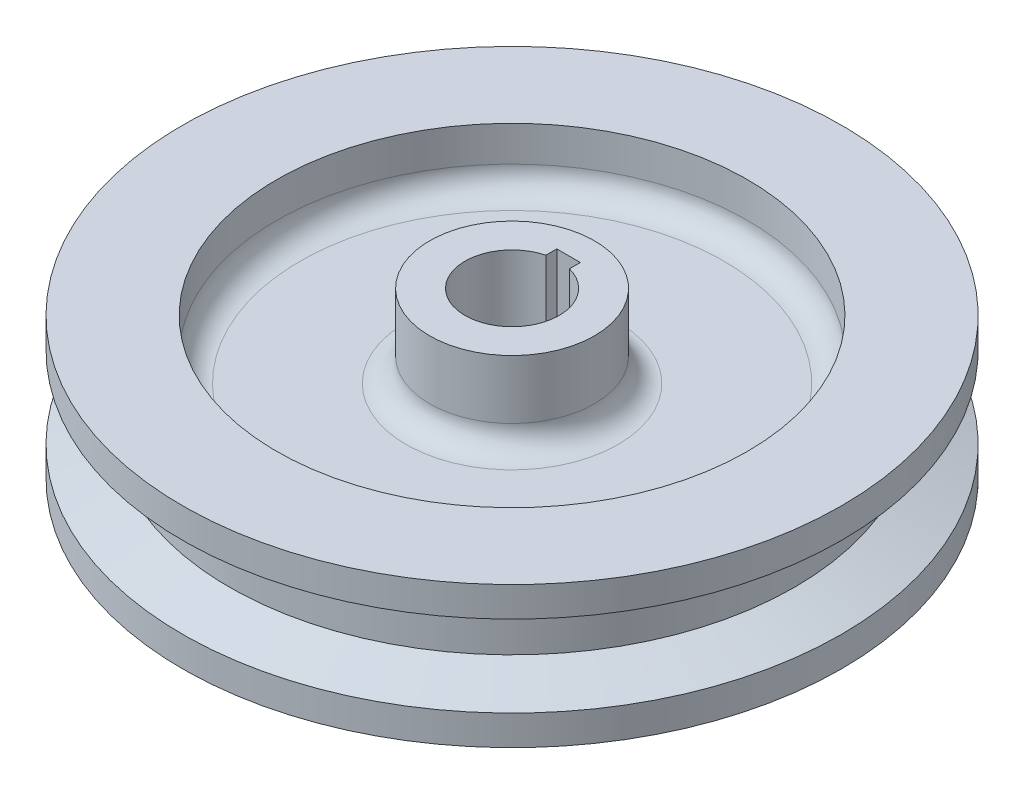
ISO-10303-21;
HEADER;
FILE_DESCRIPTION(('STEP AP214'),'2;1');
FILE_NAME('part.step','',(''),(''),'','','');
FILE_SCHEMA(('AUTOMOTIVE_DESIGN { 1 0 10303 214 1 1 1 1 }'));
ENDSEC;
DATA;
#1=APPLICATION_CONTEXT('core data for automotive mechanical design processes');
#2=APPLICATION_PROTOCOL_DEFINITION('international standard','automotive_design',2000,#1);
#3=PRODUCT_CONTEXT('',#1,'mechanical');
#4=PRODUCT('Part','Part','',(#3));
#5=PRODUCT_RELATED_PRODUCT_CATEGORY('part','',(#4));
#6=PRODUCT_DEFINITION_FORMATION('','',#4);
#7=PRODUCT_DEFINITION_CONTEXT('part definition',#1,'design');
#8=PRODUCT_DEFINITION('design','',#6,#7);
#9=PRODUCT_DEFINITION_SHAPE('','',#8);
#10=(LENGTH_UNIT() NAMED_UNIT(*) SI_UNIT(.MILLI.,.METRE.));
#11=(NAMED_UNIT(*) PLANE_ANGLE_UNIT() SI_UNIT($,.RADIAN.));
#12=(NAMED_UNIT(*) SI_UNIT($,.STERADIAN.) SOLID_ANGLE_UNIT());
#13=UNCERTAINTY_MEASURE_WITH_UNIT(LENGTH_MEASURE(1.E-05),#10,'distance_accuracy_value','');
#14=(GEOMETRIC_REPRESENTATION_CONTEXT(3) GLOBAL_UNCERTAINTY_ASSIGNED_CONTEXT((#13)) GLOBAL_UNIT_ASSIGNED_CONTEXT((#10,
#11,#12)) REPRESENTATION_CONTEXT('',''));
#15=CARTESIAN_POINT('',(0.,0.,0.));
#16=DIRECTION('',(0.,0.,1.));
#17=DIRECTION('',(1.,0.,0.));
#18=AXIS2_PLACEMENT_3D('',#15,#16,#17);
#19=CARTESIAN_POINT('',(3.49148336110938E-12,-1000.,0.));
#20=DIRECTION('',(0.,-1.,0.));
#21=DIRECTION('',(1.,0.,0.));
#22=AXIS2_PLACEMENT_3D('',#19,#20,#21);
#23=CYLINDRICAL_SURFACE('',#22,22.2250000000001);
#24=CARTESIAN_POINT('',(0.,25.4000000000001,0.));
#25=DIRECTION('',(0.,-1.,0.));
#26=DIRECTION('',(1.,0.,0.));
#27=AXIS2_PLACEMENT_3D('',#24,#25,#26);
#28=CIRCLE('',#27,22.2250000000001);
#29=CARTESIAN_POINT('',(22.225,25.4000000000002,0.));
#30=VERTEX_POINT('',#29);
#31=EDGE_CURVE('E102',#30,#30,#28,.T.);
#32=ORIENTED_EDGE('',*,*,#31,.T.);
#33=EDGE_LOOP('',(#32));
#34=FACE_BOUND('',#33,.T.);
#35=CARTESIAN_POINT('',(0.,9.52500000000001,0.));
#36=DIRECTION('',(0.,-1.,0.));
#37=DIRECTION('',(1.,0.,0.));
#38=AXIS2_PLACEMENT_3D('',#35,#36,#37);
#39=CIRCLE('',#38,22.225);
#40=CARTESIAN_POINT('',(22.225,9.52500000000008,0.));
#41=VERTEX_POINT('',#40);
#42=EDGE_CURVE('E42',#41,#41,#39,.T.);
#43=ORIENTED_EDGE('',*,*,#42,.F.);
#44=EDGE_LOOP('',(#43));
#45=FACE_BOUND('',#44,.T.);
#46=ADVANCED_FACE('F35',(#34,#45),#23,.T.);
#47=CARTESIAN_POINT('',(0.,9.525,0.));
#48=DIRECTION('',(0.,-1.,0.));
#49=DIRECTION('',(1.,0.,0.));
#50=AXIS2_PLACEMENT_3D('',#47,#48,#49);
#51=TOROIDAL_SURFACE('',#50,28.575,6.35);
#52=ORIENTED_EDGE('',*,*,#42,.T.);
#53=EDGE_LOOP('',(#52));
#54=FACE_BOUND('',#53,.T.);
#55=CARTESIAN_POINT('',(0.,3.17499999999993,0.));
#56=DIRECTION('',(0.,-1.,0.));
#57=DIRECTION('',(1.,0.,0.));
#58=AXIS2_PLACEMENT_3D('',#55,#56,#57);
#59=CIRCLE('',#58,28.5750000000001);
#60=CARTESIAN_POINT('',(28.575,3.17500000000003,0.));
#61=VERTEX_POINT('',#60);
#62=EDGE_CURVE('E155',#61,#61,#59,.T.);
#63=ORIENTED_EDGE('',*,*,#62,.F.);
#64=EDGE_LOOP('',(#63));
#65=FACE_BOUND('',#64,.T.);
#66=ADVANCED_FACE('F160',(#54,#65),#51,.F.);
#67=CARTESIAN_POINT('',(28.575,3.17499999999995,0.));
#68=DIRECTION('',(0.,1.,0.));
#69=DIRECTION('',(-1.,0.,0.));
#70=AXIS2_PLACEMENT_3D('',#67,#68,#69);
#71=PLANE('',#70);
#72=ORIENTED_EDGE('',*,*,#62,.T.);
#73=EDGE_LOOP('',(#72));
#74=FACE_BOUND('',#73,.T.);
#75=CARTESIAN_POINT('',(0.,3.17499999999971,0.));
#76=DIRECTION('',(0.,-1.,0.));
#77=DIRECTION('',(1.,0.,0.));
#78=AXIS2_PLACEMENT_3D('',#75,#76,#77);
#79=CIRCLE('',#78,57.15);
#80=CARTESIAN_POINT('',(57.15,3.17499999999991,0.));
#81=VERTEX_POINT('',#80);
#82=EDGE_CURVE('E152',#81,#81,#79,.T.);
#83=ORIENTED_EDGE('',*,*,#82,.F.);
#84=EDGE_LOOP('',(#83));
#85=FACE_BOUND('',#84,.T.);
#86=ADVANCED_FACE('F168',(#74,#85),#71,.T.);
#87=CARTESIAN_POINT('',(0.,9.52499999999978,0.));
#88=DIRECTION('',(0.,-1.,0.));
#89=DIRECTION('',(1.,0.,0.));
#90=AXIS2_PLACEMENT_3D('',#87,#88,#89);
#91=TOROIDAL_SURFACE('',#90,57.15,6.35);
#92=ORIENTED_EDGE('',*,*,#82,.T.);
#93=EDGE_LOOP('',(#92));
#94=FACE_BOUND('',#93,.T.);
#95=CARTESIAN_POINT('',(0.,9.52499999999978,0.));
#96=DIRECTION('',(0.,-1.,0.));
#97=DIRECTION('',(1.,0.,0.));
#98=AXIS2_PLACEMENT_3D('',#95,#96,#97);
#99=CIRCLE('',#98,63.5);
#100=CARTESIAN_POINT('',(63.5,9.52500000000001,0.));
#101=VERTEX_POINT('',#100);
#102=EDGE_CURVE('E149',#101,#101,#99,.T.);
#103=ORIENTED_EDGE('',*,*,#102,.F.);
#104=EDGE_LOOP('',(#103));
#105=FACE_BOUND('',#104,.T.);
#106=ADVANCED_FACE('F237',(#94,#105),#91,.F.);
#107=CARTESIAN_POINT('',(3.49148336110938E-12,-1000.,0.));
#108=DIRECTION('',(0.,-1.,0.));
#109=DIRECTION('',(1.,0.,0.));
#110=AXIS2_PLACEMENT_3D('',#107,#108,#109);
#111=CYLINDRICAL_SURFACE('',#110,63.5000000000001);
#112=ORIENTED_EDGE('',*,*,#102,.T.);
#113=EDGE_LOOP('',(#112));
#114=FACE_BOUND('',#113,.T.);
#115=CARTESIAN_POINT('',(0.,19.0499999999998,0.));
#116=DIRECTION('',(0.,-1.,0.));
#117=DIRECTION('',(1.,0.,0.));
#118=AXIS2_PLACEMENT_3D('',#115,#116,#117);
#119=CIRCLE('',#118,63.5000000000001);
#120=CARTESIAN_POINT('',(63.5,19.05,0.));
#121=VERTEX_POINT('',#120);
#122=EDGE_CURVE('E146',#121,#121,#119,.T.);
#123=ORIENTED_EDGE('',*,*,#122,.F.);
#124=EDGE_LOOP('',(#123));
#125=FACE_BOUND('',#124,.T.);
#126=ADVANCED_FACE('F233',(#114,#125),#111,.F.);
#127=CARTESIAN_POINT('',(63.5,19.05,0.));
#128=DIRECTION('',(0.,1.,0.));
#129=DIRECTION('',(-1.,0.,0.));
#130=AXIS2_PLACEMENT_3D('',#127,#128,#129);
#131=PLANE('',#130);
#132=ORIENTED_EDGE('',*,*,#122,.T.);
#133=EDGE_LOOP('',(#132));
#134=FACE_BOUND('',#133,.T.);
#135=CARTESIAN_POINT('',(0.,19.0499999999998,0.));
#136=DIRECTION('',(0.,-1.,0.));
#137=DIRECTION('',(1.,0.,0.));
#138=AXIS2_PLACEMENT_3D('',#135,#136,#137);
#139=CIRCLE('',#138,88.9);
#140=CARTESIAN_POINT('',(88.9,19.0500000000001,0.));
#141=VERTEX_POINT('',#140);
#142=EDGE_CURVE('E143',#141,#141,#139,.T.);
#143=ORIENTED_EDGE('',*,*,#142,.F.);
#144=EDGE_LOOP('',(#143));
#145=FACE_BOUND('',#144,.T.);
#146=ADVANCED_FACE('F229',(#134,#145),#131,.T.);
#147=CARTESIAN_POINT('',(3.49148336110938E-12,-1000.,0.));
#148=DIRECTION('',(0.,-1.,0.));
#149=DIRECTION('',(1.,0.,0.));
#150=AXIS2_PLACEMENT_3D('',#147,#148,#149);
#151=CYLINDRICAL_SURFACE('',#150,88.9);
#152=ORIENTED_EDGE('',*,*,#142,.T.);
#153=EDGE_LOOP('',(#152));
#154=FACE_BOUND('',#153,.T.);
#155=CARTESIAN_POINT('',(0.,10.9724219751806,0.));
#156=DIRECTION('',(0.,-1.,0.));
#157=DIRECTION('',(1.,0.,0.));
#158=AXIS2_PLACEMENT_3D('',#155,#156,#157);
#159=CIRCLE('',#158,88.9);
#160=CARTESIAN_POINT('',(88.9,10.9724219751809,0.));
#161=VERTEX_POINT('',#160);
#162=EDGE_CURVE('E140',#161,#161,#159,.T.);
#163=ORIENTED_EDGE('',*,*,#162,.F.);
#164=EDGE_LOOP('',(#163));
#165=FACE_BOUND('',#164,.T.);
#166=ADVANCED_FACE('F225',(#154,#165),#151,.T.);
#167=CARTESIAN_POINT('',(0.,6.34999999999986,0.));
#168=DIRECTION('',(0.,1.,0.));
#169=DIRECTION('',(-1.,0.,0.));
#170=AXIS2_PLACEMENT_3D('',#167,#168,#169);
#171=CONICAL_SURFACE('',#170,76.2,1.22173047639604);
#172=ORIENTED_EDGE('',*,*,#162,.T.);
#173=EDGE_LOOP('',(#172));
#174=FACE_BOUND('',#173,.T.);
#175=CARTESIAN_POINT('',(0.,6.34999999999986,0.));
#176=DIRECTION('',(0.,-1.,0.));
#177=DIRECTION('',(1.,0.,0.));
#178=AXIS2_PLACEMENT_3D('',#175,#176,#177);
#179=CIRCLE('',#178,76.2);
#180=CARTESIAN_POINT('',(76.2,6.35000000000012,0.));
#181=VERTEX_POINT('',#180);
#182=EDGE_CURVE('E137',#181,#181,#179,.T.);
#183=ORIENTED_EDGE('',*,*,#182,.F.);
#184=EDGE_LOOP('',(#183));
#185=FACE_BOUND('',#184,.T.);
#186=ADVANCED_FACE('F221',(#174,#185),#171,.T.);
#187=CARTESIAN_POINT('',(3.49148336110938E-12,-1000.,0.));
#188=DIRECTION('',(0.,-1.,0.));
#189=DIRECTION('',(1.,0.,0.));
#190=AXIS2_PLACEMENT_3D('',#187,#188,#189);
#191=CYLINDRICAL_SURFACE('',#190,76.2);
#192=ORIENTED_EDGE('',*,*,#182,.T.);
#193=EDGE_LOOP('',(#192));
#194=FACE_BOUND('',#193,.T.);
#195=CARTESIAN_POINT('',(0.,-6.35000000000019,0.));
#196=DIRECTION('',(0.,-1.,0.));
#197=DIRECTION('',(1.,0.,0.));
#198=AXIS2_PLACEMENT_3D('',#195,#196,#197);
#199=CIRCLE('',#198,76.2);
#200=CARTESIAN_POINT('',(76.2,-6.34999999999992,0.));
#201=VERTEX_POINT('',#200);
#202=EDGE_CURVE('E134',#201,#201,#199,.T.);
#203=ORIENTED_EDGE('',*,*,#202,.F.);
#204=EDGE_LOOP('',(#203));
#205=FACE_BOUND('',#204,.T.);
#206=ADVANCED_FACE('F217',(#194,#205),#191,.T.);
#207=CARTESIAN_POINT('',(0.,-10.972421975181,0.));
#208=DIRECTION('',(0.,-1.,0.));
#209=DIRECTION('',(1.,0.,0.));
#210=AXIS2_PLACEMENT_3D('',#207,#208,#209);
#211=CONICAL_SURFACE('',#210,88.8999999999999,1.22173047639603);
#212=ORIENTED_EDGE('',*,*,#202,.T.);
#213=EDGE_LOOP('',(#212));
#214=FACE_BOUND('',#213,.T.);
#215=CARTESIAN_POINT('',(0.,-10.972421975181,0.));
#216=DIRECTION('',(0.,-1.,0.));
#217=DIRECTION('',(1.,0.,0.));
#218=AXIS2_PLACEMENT_3D('',#215,#216,#217);
#219=CIRCLE('',#218,88.8999999999999);
#220=CARTESIAN_POINT('',(88.9,-10.9724219751807,0.));
#221=VERTEX_POINT('',#220);
#222=EDGE_CURVE('E131',#221,#221,#219,.T.);
#223=ORIENTED_EDGE('',*,*,#222,.F.);
#224=EDGE_LOOP('',(#223));
#225=FACE_BOUND('',#224,.T.);
#226=ADVANCED_FACE('F213',(#214,#225),#211,.T.);
#227=CARTESIAN_POINT('',(3.49148336110938E-12,-1000.,0.));
#228=DIRECTION('',(0.,-1.,0.));
#229=DIRECTION('',(1.,0.,0.));
#230=AXIS2_PLACEMENT_3D('',#227,#228,#229);
#231=CYLINDRICAL_SURFACE('',#230,88.8999999999999);
#232=ORIENTED_EDGE('',*,*,#222,.T.);
#233=EDGE_LOOP('',(#232));
#234=FACE_BOUND('',#233,.T.);
#235=CARTESIAN_POINT('',(0.,-19.0500000000003,0.));
#236=DIRECTION('',(0.,-1.,0.));
#237=DIRECTION('',(1.,0.,0.));
#238=AXIS2_PLACEMENT_3D('',#235,#236,#237);
#239=CIRCLE('',#238,88.8999999999999);
#240=CARTESIAN_POINT('',(88.9,-19.05,0.));
#241=VERTEX_POINT('',#240);
#242=EDGE_CURVE('E128',#241,#241,#239,.T.);
#243=ORIENTED_EDGE('',*,*,#242,.F.);
#244=EDGE_LOOP('',(#243));
#245=FACE_BOUND('',#244,.T.);
#246=ADVANCED_FACE('F209',(#234,#245),#231,.T.);
#247=CARTESIAN_POINT('',(63.5,-19.05,0.));
#248=DIRECTION('',(0.,-1.,0.));
#249=DIRECTION('',(1.,0.,0.));
#250=AXIS2_PLACEMENT_3D('',#247,#248,#249);
#251=PLANE('',#250);
#252=ORIENTED_EDGE('',*,*,#242,.T.);
#253=EDGE_LOOP('',(#252));
#254=FACE_BOUND('',#253,.T.);
#255=CARTESIAN_POINT('',(0.,-19.0500000000002,0.));
#256=DIRECTION('',(0.,-1.,0.));
#257=DIRECTION('',(1.,0.,0.));
#258=AXIS2_PLACEMENT_3D('',#255,#256,#257);
#259=CIRCLE('',#258,63.4999999999999);
#260=CARTESIAN_POINT('',(63.5,-19.05,0.));
#261=VERTEX_POINT('',#260);
#262=EDGE_CURVE('E125',#261,#261,#259,.T.);
#263=ORIENTED_EDGE('',*,*,#262,.F.);
#264=EDGE_LOOP('',(#263));
#265=FACE_BOUND('',#264,.T.);
#266=ADVANCED_FACE('F205',(#254,#265),#251,.T.);
#267=CARTESIAN_POINT('',(3.49148336110938E-12,-1000.,0.));
#268=DIRECTION('',(0.,-1.,0.));
#269=DIRECTION('',(1.,0.,0.));
#270=AXIS2_PLACEMENT_3D('',#267,#268,#269);
#271=CYLINDRICAL_SURFACE('',#270,63.4999999999999);
#272=ORIENTED_EDGE('',*,*,#262,.T.);
#273=EDGE_LOOP('',(#272));
#274=FACE_BOUND('',#273,.T.);
#275=CARTESIAN_POINT('',(0.,-9.52500000000023,0.));
#276=DIRECTION('',(0.,-1.,0.));
#277=DIRECTION('',(1.,0.,0.));
#278=AXIS2_PLACEMENT_3D('',#275,#276,#277);
#279=CIRCLE('',#278,63.5);
#280=CARTESIAN_POINT('',(63.5,-9.52500000000001,0.));
#281=VERTEX_POINT('',#280);
#282=EDGE_CURVE('E122',#281,#281,#279,.T.);
#283=ORIENTED_EDGE('',*,*,#282,.F.);
#284=EDGE_LOOP('',(#283));
#285=FACE_BOUND('',#284,.T.);
#286=ADVANCED_FACE('F201',(#274,#285),#271,.F.);
#287=CARTESIAN_POINT('',(0.,-9.52500000000022,0.));
#288=DIRECTION('',(0.,-1.,0.));
#289=DIRECTION('',(1.,0.,0.));
#290=AXIS2_PLACEMENT_3D('',#287,#288,#289);
#291=TOROIDAL_SURFACE('',#290,57.15,6.35);
#292=ORIENTED_EDGE('',*,*,#282,.T.);
#293=EDGE_LOOP('',(#292));
#294=FACE_BOUND('',#293,.T.);
#295=CARTESIAN_POINT('',(0.,-3.17500000000026,0.));
#296=DIRECTION('',(0.,-1.,0.));
#297=DIRECTION('',(1.,0.,0.));
#298=AXIS2_PLACEMENT_3D('',#295,#296,#297);
#299=CIRCLE('',#298,57.15);
#300=CARTESIAN_POINT('',(57.15,-3.17500000000006,0.));
#301=VERTEX_POINT('',#300);
#302=EDGE_CURVE('E119',#301,#301,#299,.T.);
#303=ORIENTED_EDGE('',*,*,#302,.F.);
#304=EDGE_LOOP('',(#303));
#305=FACE_BOUND('',#304,.T.);
#306=ADVANCED_FACE('F197',(#294,#305),#291,.F.);
#307=CARTESIAN_POINT('',(28.575,-3.17500000000005,0.));
#308=DIRECTION('',(0.,-1.,0.));
#309=DIRECTION('',(1.,0.,0.));
#310=AXIS2_PLACEMENT_3D('',#307,#308,#309);
#311=PLANE('',#310);
#312=ORIENTED_EDGE('',*,*,#302,.T.);
#313=EDGE_LOOP('',(#312));
#314=FACE_BOUND('',#313,.T.);
#315=CARTESIAN_POINT('',(0.,-3.17500000000015,0.));
#316=DIRECTION('',(0.,-1.,0.));
#317=DIRECTION('',(1.,0.,0.));
#318=AXIS2_PLACEMENT_3D('',#315,#316,#317);
#319=CIRCLE('',#318,28.575);
#320=CARTESIAN_POINT('',(28.575,-3.17500000000005,0.));
#321=VERTEX_POINT('',#320);
#322=EDGE_CURVE('E116',#321,#321,#319,.T.);
#323=ORIENTED_EDGE('',*,*,#322,.F.);
#324=EDGE_LOOP('',(#323));
#325=FACE_BOUND('',#324,.T.);
#326=ADVANCED_FACE('F193',(#314,#325),#311,.T.);
#327=CARTESIAN_POINT('',(0.,-9.52500000000011,0.));
#328=DIRECTION('',(0.,-1.,0.));
#329=DIRECTION('',(1.,0.,0.));
#330=AXIS2_PLACEMENT_3D('',#327,#328,#329);
#331=TOROIDAL_SURFACE('',#330,28.575,6.35);
#332=ORIENTED_EDGE('',*,*,#322,.T.);
#333=EDGE_LOOP('',(#332));
#334=FACE_BOUND('',#333,.T.);
#335=CARTESIAN_POINT('',(0.,-9.52500000000012,0.));
#336=DIRECTION('',(0.,-1.,0.));
#337=DIRECTION('',(1.,0.,0.));
#338=AXIS2_PLACEMENT_3D('',#335,#336,#337);
#339=CIRCLE('',#338,22.225);
#340=CARTESIAN_POINT('',(22.225,-9.52500000000004,0.));
#341=VERTEX_POINT('',#340);
#342=EDGE_CURVE('E113',#341,#341,#339,.T.);
#343=ORIENTED_EDGE('',*,*,#342,.F.);
#344=EDGE_LOOP('',(#343));
#345=FACE_BOUND('',#344,.T.);
#346=ADVANCED_FACE('F189',(#334,#345),#331,.F.);
#347=CARTESIAN_POINT('',(3.49148336110938E-12,-1000.,0.));
#348=DIRECTION('',(0.,-1.,0.));
#349=DIRECTION('',(1.,0.,0.));
#350=AXIS2_PLACEMENT_3D('',#347,#348,#349);
#351=CYLINDRICAL_SURFACE('',#350,22.2249999999999);
#352=ORIENTED_EDGE('',*,*,#342,.T.);
#353=EDGE_LOOP('',(#352));
#354=FACE_BOUND('',#353,.T.);
#355=CARTESIAN_POINT('',(0.,-25.4000000000001,0.));
#356=DIRECTION('',(0.,-1.,0.));
#357=DIRECTION('',(1.,0.,0.));
#358=AXIS2_PLACEMENT_3D('',#355,#356,#357);
#359=CIRCLE('',#358,22.2249999999999);
#360=CARTESIAN_POINT('',(22.225,-25.4,0.));
#361=VERTEX_POINT('',#360);
#362=EDGE_CURVE('E110',#361,#361,#359,.T.);
#363=ORIENTED_EDGE('',*,*,#362,.F.);
#364=EDGE_LOOP('',(#363));
#365=FACE_BOUND('',#364,.T.);
#366=ADVANCED_FACE('F185',(#354,#365),#351,.T.);
#367=CARTESIAN_POINT('',(12.7,-25.4,0.));
#368=DIRECTION('',(0.,-1.,0.));
#369=DIRECTION('',(1.,0.,0.));
#370=AXIS2_PLACEMENT_3D('',#367,#368,#369);
#371=PLANE('',#370);
#372=DIRECTION('',(0.,0.,-1.));
#373=VECTOR('',#372,1.);
#374=CARTESIAN_POINT('',(3.17500000000009,-25.4000000000001,-2.46155222390166E-11));
#375=LINE('',#374,#373);
#376=CARTESIAN_POINT('',(3.17500000000009,-25.4000000000001,-12.2967221242086));
#377=VERTEX_POINT('',#376);
#378=CARTESIAN_POINT('',(3.17500000000009,-25.4000000000001,-15.2400000000246));
#379=VERTEX_POINT('',#378);
#380=EDGE_CURVE('E83',#377,#379,#375,.T.);
#381=ORIENTED_EDGE('',*,*,#380,.T.);
#382=DIRECTION('',(-1.,0.,0.));
#383=VECTOR('',#382,1.);
#384=CARTESIAN_POINT('',(3.17500000000009,-25.4000000000001,-15.2400000000246));
#385=LINE('',#384,#383);
#386=CARTESIAN_POINT('',(-3.17500000000009,-25.4000000000001,-15.2400000000246));
#387=VERTEX_POINT('',#386);
#388=EDGE_CURVE('E82',#379,#387,#385,.T.);
#389=ORIENTED_EDGE('',*,*,#388,.T.);
#390=DIRECTION('',(0.,0.,1.));
#391=VECTOR('',#390,1.);
#392=CARTESIAN_POINT('',(-3.17499999999991,-25.4000000000001,-2.46147445882991E-11));
#393=LINE('',#392,#391);
#394=CARTESIAN_POINT('',(-3.17499999999991,-25.4000000000001,-12.2967221242086));
#395=VERTEX_POINT('',#394);
#396=EDGE_CURVE('E93',#387,#395,#393,.T.);
#397=ORIENTED_EDGE('',*,*,#396,.T.);
#398=CARTESIAN_POINT('',(0.,-25.4,0.));
#399=DIRECTION('',(0.,-1.,0.));
#400=DIRECTION('',(1.,0.,0.));
#401=AXIS2_PLACEMENT_3D('',#398,#399,#400);
#402=CIRCLE('',#401,12.6999999999999);
#403=EDGE_CURVE('E107',#377,#395,#402,.T.);
#404=ORIENTED_EDGE('',*,*,#403,.F.);
#405=EDGE_LOOP('',(#381,#389,#397,#404));
#406=FACE_BOUND('',#405,.T.);
#407=ORIENTED_EDGE('',*,*,#362,.T.);
#408=EDGE_LOOP('',(#407));
#409=FACE_BOUND('',#408,.T.);
#410=ADVANCED_FACE('F178',(#406,#409),#371,.T.);
#411=CARTESIAN_POINT('',(3.49148336110938E-12,-1000.,0.));
#412=DIRECTION('',(0.,-1.,0.));
#413=DIRECTION('',(1.,0.,0.));
#414=AXIS2_PLACEMENT_3D('',#411,#412,#413);
#415=CYLINDRICAL_SURFACE('',#414,12.7);
#416=DIRECTION('',(0.,-1.,0.));
#417=VECTOR('',#416,1.);
#418=CARTESIAN_POINT('',(3.17500000000349,-1000.,-12.2967221242086));
#419=LINE('',#418,#417);
#420=CARTESIAN_POINT('',(3.17499999999991,25.3999999999999,-12.2967221242086));
#421=VERTEX_POINT('',#420);
#422=EDGE_CURVE('E56',#377,#421,#419,.F.);
#423=ORIENTED_EDGE('',*,*,#422,.F.);
#424=ORIENTED_EDGE('',*,*,#403,.T.);
#425=DIRECTION('',(0.,-1.,0.));
#426=VECTOR('',#425,1.);
#427=CARTESIAN_POINT('',(-3.17499999999651,-1000.,-12.2967221242086));
#428=LINE('',#427,#426);
#429=CARTESIAN_POINT('',(-3.17500000000009,25.3999999999999,-12.2967221242086));
#430=VERTEX_POINT('',#429);
#431=EDGE_CURVE('E96',#430,#395,#428,.T.);
#432=ORIENTED_EDGE('',*,*,#431,.F.);
#433=CARTESIAN_POINT('',(0.,25.4000000000001,0.));
#434=DIRECTION('',(0.,-1.,0.));
#435=DIRECTION('',(1.,0.,0.));
#436=AXIS2_PLACEMENT_3D('',#433,#434,#435);
#437=CIRCLE('',#436,12.7000000000001);
#438=EDGE_CURVE('E105',#421,#430,#437,.T.);
#439=ORIENTED_EDGE('',*,*,#438,.F.);
#440=EDGE_LOOP('',(#423,#424,#432,#439));
#441=FACE_BOUND('',#440,.T.);
#442=ADVANCED_FACE('F171',(#441),#415,.F.);
#443=CARTESIAN_POINT('',(12.7,25.4,0.));
#444=DIRECTION('',(0.,1.,0.));
#445=DIRECTION('',(-1.,0.,0.));
#446=AXIS2_PLACEMENT_3D('',#443,#444,#445);
#447=PLANE('',#446);
#448=DIRECTION('',(0.,0.,-1.));
#449=VECTOR('',#448,1.);
#450=CARTESIAN_POINT('',(3.17499999999991,25.3999999999999,0.));
#451=LINE('',#450,#449);
#452=CARTESIAN_POINT('',(3.17499999999991,25.3999999999999,-15.2400000000246));
#453=VERTEX_POINT('',#452);
#454=EDGE_CURVE('E11',#421,#453,#451,.T.);
#455=ORIENTED_EDGE('',*,*,#454,.F.);
#456=ORIENTED_EDGE('',*,*,#438,.T.);
#457=DIRECTION('',(0.,0.,1.));
#458=VECTOR('',#457,1.);
#459=CARTESIAN_POINT('',(-3.17500000000009,25.3999999999999,-2.46147445882991E-11));
#460=LINE('',#459,#458);
#461=CARTESIAN_POINT('',(-3.17500000000009,25.3999999999999,-15.2400000000246));
#462=VERTEX_POINT('',#461);
#463=EDGE_CURVE('E88',#462,#430,#460,.T.);
#464=ORIENTED_EDGE('',*,*,#463,.F.);
#465=DIRECTION('',(-1.,0.,0.));
#466=VECTOR('',#465,1.);
#467=CARTESIAN_POINT('',(3.17499999999991,25.3999999999999,-15.2400000000246));
#468=LINE('',#467,#466);
#469=EDGE_CURVE('E49',#453,#462,#468,.T.);
#470=ORIENTED_EDGE('',*,*,#469,.F.);
#471=EDGE_LOOP('',(#455,#456,#464,#470));
#472=FACE_BOUND('',#471,.T.);
#473=ORIENTED_EDGE('',*,*,#31,.F.);
#474=EDGE_LOOP('',(#473));
#475=FACE_BOUND('',#474,.T.);
#476=ADVANCED_FACE('F86',(#472,#475),#447,.T.);
#477=CARTESIAN_POINT('',(3.17500000000015,-41.91,-2.46155222390166E-11));
#478=DIRECTION('',(1.,0.,0.));
#479=DIRECTION('',(0.,1.,0.));
#480=AXIS2_PLACEMENT_3D('',#477,#478,#479);
#481=PLANE('',#480);
#482=ORIENTED_EDGE('',*,*,#422,.T.);
#483=ORIENTED_EDGE('',*,*,#454,.T.);
#484=DIRECTION('',(0.,1.,0.));
#485=VECTOR('',#484,1.);
#486=CARTESIAN_POINT('',(3.17500000000015,-41.91,-15.2400000000246));
#487=LINE('',#486,#485);
#488=EDGE_CURVE('E75',#379,#453,#487,.T.);
#489=ORIENTED_EDGE('',*,*,#488,.F.);
#490=ORIENTED_EDGE('',*,*,#380,.F.);
#491=EDGE_LOOP('',(#482,#483,#489,#490));
#492=FACE_BOUND('',#491,.T.);
#493=ADVANCED_FACE('F74',(#492),#481,.F.);
#494=CARTESIAN_POINT('',(3.17500000000015,-41.91,-15.2400000000246));
#495=DIRECTION('',(0.,0.,-1.));
#496=DIRECTION('',(-1.,0.,0.));
#497=AXIS2_PLACEMENT_3D('',#494,#495,#496);
#498=PLANE('',#497);
#499=ORIENTED_EDGE('',*,*,#488,.T.);
#500=ORIENTED_EDGE('',*,*,#469,.T.);
#501=DIRECTION('',(0.,1.,0.));
#502=VECTOR('',#501,1.);
#503=CARTESIAN_POINT('',(-3.17499999999985,-41.9100000000001,-15.2400000000246));
#504=LINE('',#503,#502);
#505=EDGE_CURVE('E97',#387,#462,#504,.T.);
#506=ORIENTED_EDGE('',*,*,#505,.F.);
#507=ORIENTED_EDGE('',*,*,#388,.F.);
#508=EDGE_LOOP('',(#499,#500,#506,#507));
#509=FACE_BOUND('',#508,.T.);
#510=ADVANCED_FACE('F80',(#509),#498,.F.);
#511=CARTESIAN_POINT('',(-3.17499999999985,-41.9100000000001,-2.46147445882991E-11));
#512=DIRECTION('',(-1.,0.,0.));
#513=DIRECTION('',(0.,-1.,0.));
#514=AXIS2_PLACEMENT_3D('',#511,#512,#513);
#515=PLANE('',#514);
#516=ORIENTED_EDGE('',*,*,#431,.T.);
#517=ORIENTED_EDGE('',*,*,#396,.F.);
#518=ORIENTED_EDGE('',*,*,#505,.T.);
#519=ORIENTED_EDGE('',*,*,#463,.T.);
#520=EDGE_LOOP('',(#516,#517,#518,#519));
#521=FACE_BOUND('',#520,.T.);
#522=ADVANCED_FACE('F363',(#521),#515,.F.);
#523=CLOSED_SHELL('',(#46,#66,#86,#106,#126,#146,#166,#186,#206,#226,#246,#266,#286,#306,#326,
#346,#366,#410,#442,#476,#493,#510,#522));
#524=MANIFOLD_SOLID_BREP('B2',#523);
#525=ADVANCED_BREP_SHAPE_REPRESENTATION('',(#18,#524),#14);
#526=SHAPE_DEFINITION_REPRESENTATION(#9,#525);
ENDSEC;
END-ISO-10303-21;
